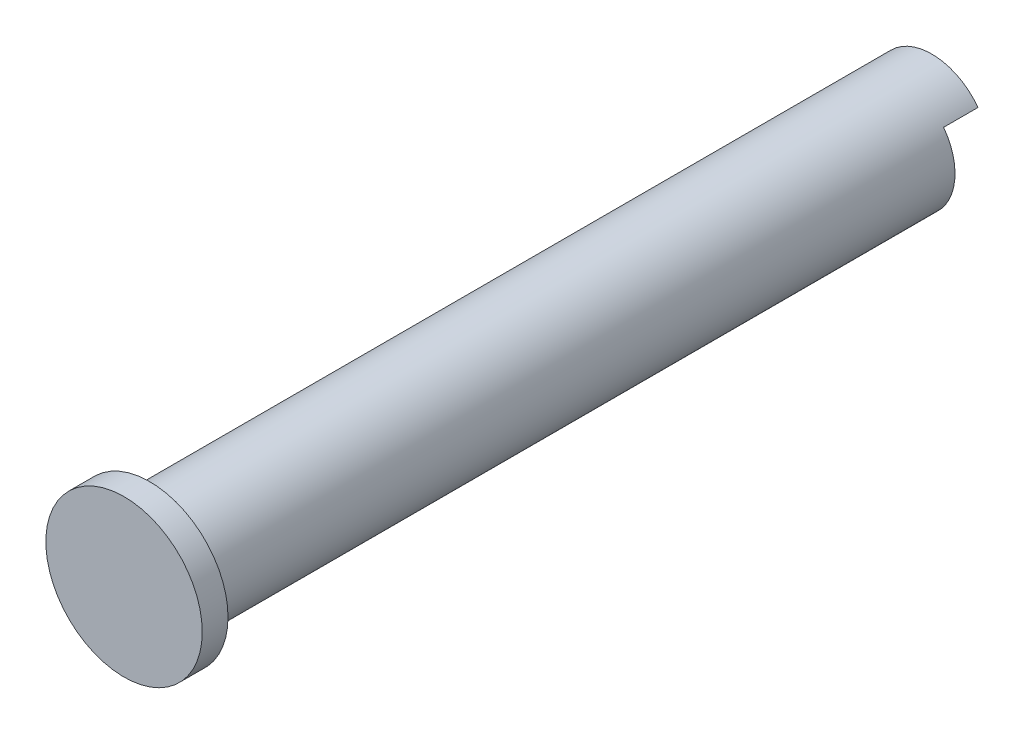
ISO-10303-21;
HEADER;
FILE_DESCRIPTION(('STEP AP214'),'2;1');
FILE_NAME('part.step','',(''),(''),'','','');
FILE_SCHEMA(('AUTOMOTIVE_DESIGN { 1 0 10303 214 1 1 1 1 }'));
ENDSEC;
DATA;
#1=APPLICATION_CONTEXT('core data for automotive mechanical design processes');
#2=APPLICATION_PROTOCOL_DEFINITION('international standard','automotive_design',2000,#1);
#3=PRODUCT_CONTEXT('',#1,'mechanical');
#4=PRODUCT('Part','Part','',(#3));
#5=PRODUCT_RELATED_PRODUCT_CATEGORY('part','',(#4));
#6=PRODUCT_DEFINITION_FORMATION('','',#4);
#7=PRODUCT_DEFINITION_CONTEXT('part definition',#1,'design');
#8=PRODUCT_DEFINITION('design','',#6,#7);
#9=PRODUCT_DEFINITION_SHAPE('','',#8);
#10=(LENGTH_UNIT() NAMED_UNIT(*) SI_UNIT(.MILLI.,.METRE.));
#11=(NAMED_UNIT(*) PLANE_ANGLE_UNIT() SI_UNIT($,.RADIAN.));
#12=(NAMED_UNIT(*) SI_UNIT($,.STERADIAN.) SOLID_ANGLE_UNIT());
#13=UNCERTAINTY_MEASURE_WITH_UNIT(LENGTH_MEASURE(1.E-05),#10,'distance_accuracy_value','');
#14=(GEOMETRIC_REPRESENTATION_CONTEXT(3) GLOBAL_UNCERTAINTY_ASSIGNED_CONTEXT((#13)) GLOBAL_UNIT_ASSIGNED_CONTEXT((#10,
#11,#12)) REPRESENTATION_CONTEXT('',''));
#15=CARTESIAN_POINT('',(0.,0.,0.));
#16=DIRECTION('',(0.,0.,1.));
#17=DIRECTION('',(1.,0.,0.));
#18=AXIS2_PLACEMENT_3D('',#15,#16,#17);
#19=CARTESIAN_POINT('',(0.,0.,-3.));
#20=DIRECTION('',(0.,0.,1.));
#21=DIRECTION('',(1.,0.,0.));
#22=AXIS2_PLACEMENT_3D('',#19,#20,#21);
#23=CYLINDRICAL_SURFACE('',#22,9.1);
#24=CARTESIAN_POINT('',(0.,0.,-3.));
#25=DIRECTION('',(0.,0.,1.));
#26=DIRECTION('',(1.,0.,0.));
#27=AXIS2_PLACEMENT_3D('',#24,#25,#26);
#28=CIRCLE('',#27,9.1);
#29=CARTESIAN_POINT('',(9.1,0.,-3.));
#30=VERTEX_POINT('',#29);
#31=EDGE_CURVE('E49',#30,#30,#28,.T.);
#32=ORIENTED_EDGE('',*,*,#31,.T.);
#33=EDGE_LOOP('',(#32));
#34=FACE_BOUND('',#33,.T.);
#35=CARTESIAN_POINT('',(0.,0.,0.));
#36=DIRECTION('',(0.,0.,1.));
#37=DIRECTION('',(1.,0.,0.));
#38=AXIS2_PLACEMENT_3D('',#35,#36,#37);
#39=CIRCLE('',#38,9.1);
#40=CARTESIAN_POINT('',(9.1,0.,0.));
#41=VERTEX_POINT('',#40);
#42=EDGE_CURVE('E44',#41,#41,#39,.T.);
#43=ORIENTED_EDGE('',*,*,#42,.F.);
#44=EDGE_LOOP('',(#43));
#45=FACE_BOUND('',#44,.T.);
#46=ADVANCED_FACE('F41',(#34,#45),#23,.T.);
#47=CARTESIAN_POINT('',(0.,0.,-3.));
#48=DIRECTION('',(0.,0.,1.));
#49=DIRECTION('',(1.,0.,0.));
#50=AXIS2_PLACEMENT_3D('',#47,#48,#49);
#51=PLANE('',#50);
#52=CARTESIAN_POINT('',(0.,0.,-3.));
#53=DIRECTION('',(0.,0.,-1.));
#54=DIRECTION('',(-1.,0.,0.));
#55=AXIS2_PLACEMENT_3D('',#52,#53,#54);
#56=CIRCLE('',#55,6.7);
#57=CARTESIAN_POINT('',(-6.7,0.,-3.));
#58=VERTEX_POINT('',#57);
#59=EDGE_CURVE('E11',#58,#58,#56,.T.);
#60=ORIENTED_EDGE('',*,*,#59,.F.);
#61=EDGE_LOOP('',(#60));
#62=FACE_BOUND('',#61,.T.);
#63=ORIENTED_EDGE('',*,*,#31,.F.);
#64=EDGE_LOOP('',(#63));
#65=FACE_BOUND('',#64,.T.);
#66=ADVANCED_FACE('F107',(#62,#65),#51,.F.);
#67=CARTESIAN_POINT('',(0.,0.,0.));
#68=DIRECTION('',(0.,0.,1.));
#69=DIRECTION('',(1.,0.,0.));
#70=AXIS2_PLACEMENT_3D('',#67,#68,#69);
#71=PLANE('',#70);
#72=ORIENTED_EDGE('',*,*,#42,.T.);
#73=EDGE_LOOP('',(#72));
#74=FACE_BOUND('',#73,.T.);
#75=ADVANCED_FACE('F104',(#74),#71,.T.);
#76=CARTESIAN_POINT('',(0.,0.,-90.));
#77=DIRECTION('',(0.,0.,1.));
#78=DIRECTION('',(1.,0.,0.));
#79=AXIS2_PLACEMENT_3D('',#76,#77,#78);
#80=CYLINDRICAL_SURFACE('',#79,6.7);
#81=CARTESIAN_POINT('',(0.,0.,-90.));
#82=DIRECTION('',(0.,0.,-1.));
#83=DIRECTION('',(-1.,0.,0.));
#84=AXIS2_PLACEMENT_3D('',#81,#82,#83);
#85=CIRCLE('',#84,6.7);
#86=CARTESIAN_POINT('',(5.37494186015068,4.,-90.));
#87=VERTEX_POINT('',#86);
#88=CARTESIAN_POINT('',(-5.37494186015068,4.,-90.));
#89=VERTEX_POINT('',#88);
#90=EDGE_CURVE('E87',#87,#89,#85,.T.);
#91=ORIENTED_EDGE('',*,*,#90,.F.);
#92=DIRECTION('',(0.,0.,1.));
#93=VECTOR('',#92,1.);
#94=CARTESIAN_POINT('',(5.37494186015068,4.,-94.));
#95=LINE('',#94,#93);
#96=CARTESIAN_POINT('',(5.37494186015068,4.,-94.));
#97=VERTEX_POINT('',#96);
#98=EDGE_CURVE('E75',#97,#87,#95,.T.);
#99=ORIENTED_EDGE('',*,*,#98,.F.);
#100=CARTESIAN_POINT('',(0.,0.,-94.));
#101=DIRECTION('',(0.,0.,-1.));
#102=DIRECTION('',(1.,0.,0.));
#103=AXIS2_PLACEMENT_3D('',#100,#101,#102);
#104=CIRCLE('',#103,6.7);
#105=CARTESIAN_POINT('',(-5.37494186015068,4.,-94.));
#106=VERTEX_POINT('',#105);
#107=EDGE_CURVE('E80',#106,#97,#104,.T.);
#108=ORIENTED_EDGE('',*,*,#107,.F.);
#109=DIRECTION('',(0.,0.,1.));
#110=VECTOR('',#109,1.);
#111=CARTESIAN_POINT('',(-5.37494186015068,4.,-94.));
#112=LINE('',#111,#110);
#113=EDGE_CURVE('E77',#106,#89,#112,.T.);
#114=ORIENTED_EDGE('',*,*,#113,.T.);
#115=EDGE_LOOP('',(#91,#99,#108,#114));
#116=FACE_BOUND('',#115,.T.);
#117=ORIENTED_EDGE('',*,*,#59,.T.);
#118=EDGE_LOOP('',(#117));
#119=FACE_BOUND('',#118,.T.);
#120=ADVANCED_FACE('F85',(#116,#119),#80,.T.);
#121=CARTESIAN_POINT('',(0.,0.,-90.));
#122=DIRECTION('',(0.,0.,-1.));
#123=DIRECTION('',(-1.,0.,0.));
#124=AXIS2_PLACEMENT_3D('',#121,#122,#123);
#125=PLANE('',#124);
#126=DIRECTION('',(-1.,0.,0.));
#127=VECTOR('',#126,1.);
#128=CARTESIAN_POINT('',(5.37494186015068,4.,-90.));
#129=LINE('',#128,#127);
#130=EDGE_CURVE('E56',#87,#89,#129,.T.);
#131=ORIENTED_EDGE('',*,*,#130,.F.);
#132=ORIENTED_EDGE('',*,*,#90,.T.);
#133=EDGE_LOOP('',(#131,#132));
#134=FACE_BOUND('',#133,.T.);
#135=CARTESIAN_POINT('',(0.,0.,-90.));
#136=DIRECTION('',(0.,0.,-1.));
#137=DIRECTION('',(-1.,0.,0.));
#138=AXIS2_PLACEMENT_3D('',#135,#136,#137);
#139=CIRCLE('',#138,2.09999999999999);
#140=CARTESIAN_POINT('',(-2.09999999999999,0.,-90.));
#141=VERTEX_POINT('',#140);
#142=EDGE_CURVE('E88',#141,#141,#139,.T.);
#143=ORIENTED_EDGE('',*,*,#142,.F.);
#144=EDGE_LOOP('',(#143));
#145=FACE_BOUND('',#144,.T.);
#146=ADVANCED_FACE('F121',(#134,#145),#125,.T.);
#147=CARTESIAN_POINT('',(0.,0.,-68.));
#148=DIRECTION('',(0.,0.,-1.));
#149=DIRECTION('',(-1.,0.,0.));
#150=AXIS2_PLACEMENT_3D('',#147,#148,#149);
#151=CONICAL_SURFACE('',#150,2.09999999999999,1.02974425867665);
#152=CARTESIAN_POINT('',(0.,0.,-66.7381927000421));
#153=VERTEX_POINT('',#152);
#154=VERTEX_LOOP('',#153);
#155=FACE_BOUND('',#154,.T.);
#156=CARTESIAN_POINT('',(0.,0.,-68.));
#157=DIRECTION('',(0.,0.,-1.));
#158=DIRECTION('',(-1.,0.,0.));
#159=AXIS2_PLACEMENT_3D('',#156,#157,#158);
#160=CIRCLE('',#159,2.09999999999999);
#161=CARTESIAN_POINT('',(-2.09999999999999,0.,-68.));
#162=VERTEX_POINT('',#161);
#163=EDGE_CURVE('E91',#162,#162,#160,.T.);
#164=ORIENTED_EDGE('',*,*,#163,.T.);
#165=EDGE_LOOP('',(#164));
#166=FACE_BOUND('',#165,.T.);
#167=ADVANCED_FACE('F124',(#155,#166),#151,.F.);
#168=CARTESIAN_POINT('',(0.,0.,-90.));
#169=DIRECTION('',(0.,0.,-1.));
#170=DIRECTION('',(-1.,0.,0.));
#171=AXIS2_PLACEMENT_3D('',#168,#169,#170);
#172=CYLINDRICAL_SURFACE('',#171,2.09999999999999);
#173=ORIENTED_EDGE('',*,*,#163,.F.);
#174=EDGE_LOOP('',(#173));
#175=FACE_BOUND('',#174,.T.);
#176=ORIENTED_EDGE('',*,*,#142,.T.);
#177=EDGE_LOOP('',(#176));
#178=FACE_BOUND('',#177,.T.);
#179=ADVANCED_FACE('F127',(#175,#178),#172,.F.);
#180=CARTESIAN_POINT('',(5.37494186015068,4.,-94.));
#181=DIRECTION('',(0.,1.,0.));
#182=DIRECTION('',(0.,0.,1.));
#183=AXIS2_PLACEMENT_3D('',#180,#181,#182);
#184=PLANE('',#183);
#185=ORIENTED_EDGE('',*,*,#130,.T.);
#186=ORIENTED_EDGE('',*,*,#113,.F.);
#187=DIRECTION('',(-1.,0.,0.));
#188=VECTOR('',#187,1.);
#189=CARTESIAN_POINT('',(5.37494186015068,4.,-94.));
#190=LINE('',#189,#188);
#191=EDGE_CURVE('E71',#97,#106,#190,.T.);
#192=ORIENTED_EDGE('',*,*,#191,.F.);
#193=ORIENTED_EDGE('',*,*,#98,.T.);
#194=EDGE_LOOP('',(#185,#186,#192,#193));
#195=FACE_BOUND('',#194,.T.);
#196=ADVANCED_FACE('F73',(#195),#184,.F.);
#197=CARTESIAN_POINT('',(0.,0.,-94.));
#198=DIRECTION('',(0.,0.,1.));
#199=DIRECTION('',(1.,0.,0.));
#200=AXIS2_PLACEMENT_3D('',#197,#198,#199);
#201=PLANE('',#200);
#202=ORIENTED_EDGE('',*,*,#107,.T.);
#203=ORIENTED_EDGE('',*,*,#191,.T.);
#204=EDGE_LOOP('',(#202,#203));
#205=FACE_BOUND('',#204,.T.);
#206=ADVANCED_FACE('F82',(#205),#201,.F.);
#207=CLOSED_SHELL('',(#46,#66,#75,#120,#146,#167,#179,#196,#206));
#208=MANIFOLD_SOLID_BREP('B2',#207);
#209=ADVANCED_BREP_SHAPE_REPRESENTATION('',(#18,#208),#14);
#210=SHAPE_DEFINITION_REPRESENTATION(#9,#209);
ENDSEC;
END-ISO-10303-21;
